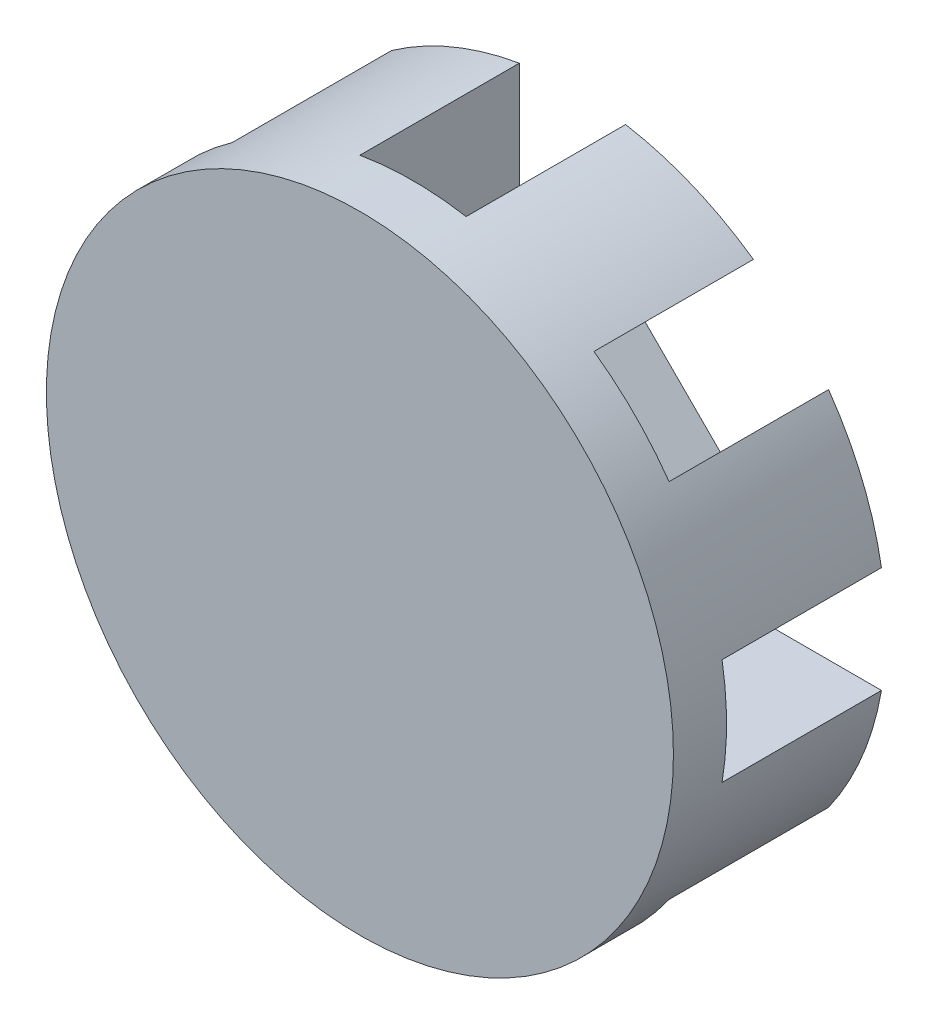
ISO-10303-21;
HEADER;
FILE_DESCRIPTION(('STEP AP214'),'2;1');
FILE_NAME('part.step','',(''),(''),'','','');
FILE_SCHEMA(('AUTOMOTIVE_DESIGN { 1 0 10303 214 1 1 1 1 }'));
ENDSEC;
DATA;
#1=APPLICATION_CONTEXT('core data for automotive mechanical design processes');
#2=APPLICATION_PROTOCOL_DEFINITION('international standard','automotive_design',2000,#1);
#3=PRODUCT_CONTEXT('',#1,'mechanical');
#4=PRODUCT('Part','Part','',(#3));
#5=PRODUCT_RELATED_PRODUCT_CATEGORY('part','',(#4));
#6=PRODUCT_DEFINITION_FORMATION('','',#4);
#7=PRODUCT_DEFINITION_CONTEXT('part definition',#1,'design');
#8=PRODUCT_DEFINITION('design','',#6,#7);
#9=PRODUCT_DEFINITION_SHAPE('','',#8);
#10=(LENGTH_UNIT() NAMED_UNIT(*) SI_UNIT(.MILLI.,.METRE.));
#11=(NAMED_UNIT(*) PLANE_ANGLE_UNIT() SI_UNIT($,.RADIAN.));
#12=(NAMED_UNIT(*) SI_UNIT($,.STERADIAN.) SOLID_ANGLE_UNIT());
#13=UNCERTAINTY_MEASURE_WITH_UNIT(LENGTH_MEASURE(1.E-05),#10,'distance_accuracy_value','');
#14=(GEOMETRIC_REPRESENTATION_CONTEXT(3) GLOBAL_UNCERTAINTY_ASSIGNED_CONTEXT((#13)) GLOBAL_UNIT_ASSIGNED_CONTEXT((#10,
#11,#12)) REPRESENTATION_CONTEXT('',''));
#15=CARTESIAN_POINT('',(0.,0.,0.));
#16=DIRECTION('',(0.,0.,1.));
#17=DIRECTION('',(1.,0.,0.));
#18=AXIS2_PLACEMENT_3D('',#15,#16,#17);
#19=CARTESIAN_POINT('',(0.,0.,4.));
#20=DIRECTION('',(0.,0.,-1.));
#21=DIRECTION('',(-1.,0.,0.));
#22=AXIS2_PLACEMENT_3D('',#19,#20,#21);
#23=CYLINDRICAL_SURFACE('',#22,5.9);
#24=CARTESIAN_POINT('',(0.,0.,4.));
#25=DIRECTION('',(0.,0.,1.));
#26=DIRECTION('',(1.,0.,0.));
#27=AXIS2_PLACEMENT_3D('',#24,#25,#26);
#28=CIRCLE('',#27,5.9);
#29=CARTESIAN_POINT('',(5.9,0.,4.));
#30=VERTEX_POINT('',#29);
#31=EDGE_CURVE('E11',#30,#30,#28,.T.);
#32=ORIENTED_EDGE('',*,*,#31,.F.);
#33=EDGE_LOOP('',(#32));
#34=FACE_BOUND('',#33,.T.);
#35=DIRECTION('',(0.,0.,-1.));
#36=VECTOR('',#35,1.);
#37=CARTESIAN_POINT('',(-5.81463670404265,-1.00000000000002,3.));
#38=LINE('',#37,#36);
#39=CARTESIAN_POINT('',(-5.81463670404265,-1.00000000000002,3.));
#40=VERTEX_POINT('',#39);
#41=CARTESIAN_POINT('',(-5.81463670404265,-1.00000000000002,0.));
#42=VERTEX_POINT('',#41);
#43=EDGE_CURVE('E326',#40,#42,#38,.T.);
#44=ORIENTED_EDGE('',*,*,#43,.T.);
#45=CARTESIAN_POINT('',(0.,0.,0.));
#46=DIRECTION('',(0.,0.,1.));
#47=DIRECTION('',(1.,0.,0.));
#48=AXIS2_PLACEMENT_3D('',#45,#46,#47);
#49=CIRCLE('',#48,5.9);
#50=CARTESIAN_POINT('',(-4.81867582475129,-3.40446226237824,0.));
#51=VERTEX_POINT('',#50);
#52=EDGE_CURVE('E497',#42,#51,#49,.T.);
#53=ORIENTED_EDGE('',*,*,#52,.T.);
#54=DIRECTION('',(0.,0.,-1.));
#55=VECTOR('',#54,1.);
#56=CARTESIAN_POINT('',(-4.81867582475128,-3.40446226237823,3.));
#57=LINE('',#56,#55);
#58=CARTESIAN_POINT('',(-4.81867582475128,-3.40446226237823,3.));
#59=VERTEX_POINT('',#58);
#60=EDGE_CURVE('E345',#59,#51,#57,.T.);
#61=ORIENTED_EDGE('',*,*,#60,.F.);
#62=CARTESIAN_POINT('',(0.,0.,3.));
#63=DIRECTION('',(0.,0.,-1.));
#64=DIRECTION('',(0.707106781186551,-0.707106781186544,0.));
#65=AXIS2_PLACEMENT_3D('',#62,#63,#64);
#66=CIRCLE('',#65,5.9);
#67=CARTESIAN_POINT('',(-3.40446226237818,-4.81867582475132,3.));
#68=VERTEX_POINT('',#67);
#69=EDGE_CURVE('E334',#68,#59,#66,.T.);
#70=ORIENTED_EDGE('',*,*,#69,.F.);
#71=DIRECTION('',(0.,0.,-1.));
#72=VECTOR('',#71,1.);
#73=CARTESIAN_POINT('',(-3.40446226237818,-4.81867582475132,3.));
#74=LINE('',#73,#72);
#75=CARTESIAN_POINT('',(-3.40446226237818,-4.81867582475132,0.));
#76=VERTEX_POINT('',#75);
#77=EDGE_CURVE('E321',#68,#76,#74,.T.);
#78=ORIENTED_EDGE('',*,*,#77,.T.);
#79=CARTESIAN_POINT('',(-1.,-5.81463670404265,0.));
#80=VERTEX_POINT('',#79);
#81=EDGE_CURVE('E503',#76,#80,#49,.T.);
#82=ORIENTED_EDGE('',*,*,#81,.T.);
#83=DIRECTION('',(0.,0.,-1.));
#84=VECTOR('',#83,1.);
#85=CARTESIAN_POINT('',(-1.,-5.81463670404265,3.));
#86=LINE('',#85,#84);
#87=CARTESIAN_POINT('',(-1.,-5.81463670404265,3.));
#88=VERTEX_POINT('',#87);
#89=EDGE_CURVE('E373',#88,#80,#86,.T.);
#90=ORIENTED_EDGE('',*,*,#89,.F.);
#91=CARTESIAN_POINT('',(0.,0.,3.));
#92=DIRECTION('',(0.,0.,-1.));
#93=DIRECTION('',(1.,0.,0.));
#94=AXIS2_PLACEMENT_3D('',#91,#92,#93);
#95=CIRCLE('',#94,5.9);
#96=CARTESIAN_POINT('',(1.,-5.81463670404265,3.));
#97=VERTEX_POINT('',#96);
#98=EDGE_CURVE('E362',#97,#88,#95,.T.);
#99=ORIENTED_EDGE('',*,*,#98,.F.);
#100=DIRECTION('',(0.,0.,-1.));
#101=VECTOR('',#100,1.);
#102=CARTESIAN_POINT('',(1.,-5.81463670404265,3.));
#103=LINE('',#102,#101);
#104=CARTESIAN_POINT('',(1.,-5.81463670404265,0.));
#105=VERTEX_POINT('',#104);
#106=EDGE_CURVE('E350',#97,#105,#103,.T.);
#107=ORIENTED_EDGE('',*,*,#106,.T.);
#108=CARTESIAN_POINT('',(3.40446226237825,-4.81867582475128,0.));
#109=VERTEX_POINT('',#108);
#110=EDGE_CURVE('E501',#105,#109,#49,.T.);
#111=ORIENTED_EDGE('',*,*,#110,.T.);
#112=DIRECTION('',(0.,0.,-1.));
#113=VECTOR('',#112,1.);
#114=CARTESIAN_POINT('',(3.40446226237825,-4.81867582475127,3.));
#115=LINE('',#114,#113);
#116=CARTESIAN_POINT('',(3.40446226237825,-4.81867582475127,3.));
#117=VERTEX_POINT('',#116);
#118=EDGE_CURVE('E401',#117,#109,#115,.T.);
#119=ORIENTED_EDGE('',*,*,#118,.F.);
#120=CARTESIAN_POINT('',(0.,0.,3.));
#121=DIRECTION('',(0.,0.,-1.));
#122=DIRECTION('',(0.707106781186541,0.707106781186554,0.));
#123=AXIS2_PLACEMENT_3D('',#120,#121,#122);
#124=CIRCLE('',#123,5.9);
#125=CARTESIAN_POINT('',(4.81867582475133,-3.40446226237817,3.));
#126=VERTEX_POINT('',#125);
#127=EDGE_CURVE('E390',#126,#117,#124,.T.);
#128=ORIENTED_EDGE('',*,*,#127,.F.);
#129=DIRECTION('',(0.,0.,-1.));
#130=VECTOR('',#129,1.);
#131=CARTESIAN_POINT('',(4.81867582475133,-3.40446226237817,3.));
#132=LINE('',#131,#130);
#133=CARTESIAN_POINT('',(4.81867582475133,-3.40446226237817,0.));
#134=VERTEX_POINT('',#133);
#135=EDGE_CURVE('E378',#126,#134,#132,.T.);
#136=ORIENTED_EDGE('',*,*,#135,.T.);
#137=CARTESIAN_POINT('',(5.81463670404267,-0.999999999999939,0.));
#138=VERTEX_POINT('',#137);
#139=EDGE_CURVE('E271',#134,#138,#49,.T.);
#140=ORIENTED_EDGE('',*,*,#139,.T.);
#141=DIRECTION('',(0.,0.,-1.));
#142=VECTOR('',#141,1.);
#143=CARTESIAN_POINT('',(5.81463670404266,-0.999999999999939,3.));
#144=LINE('',#143,#142);
#145=CARTESIAN_POINT('',(5.81463670404266,-0.999999999999939,3.));
#146=VERTEX_POINT('',#145);
#147=EDGE_CURVE('E63',#146,#138,#144,.T.);
#148=ORIENTED_EDGE('',*,*,#147,.F.);
#149=CARTESIAN_POINT('',(0.,0.,3.));
#150=DIRECTION('',(0.,0.,-1.));
#151=DIRECTION('',(0.,1.,0.));
#152=AXIS2_PLACEMENT_3D('',#149,#150,#151);
#153=CIRCLE('',#152,5.9);
#154=CARTESIAN_POINT('',(5.81463670404264,1.00000000000006,3.));
#155=VERTEX_POINT('',#154);
#156=EDGE_CURVE('E257',#155,#146,#153,.T.);
#157=ORIENTED_EDGE('',*,*,#156,.F.);
#158=DIRECTION('',(0.,0.,-1.));
#159=VECTOR('',#158,1.);
#160=CARTESIAN_POINT('',(5.81463670404264,1.00000000000006,3.));
#161=LINE('',#160,#159);
#162=CARTESIAN_POINT('',(5.81463670404264,1.00000000000006,0.));
#163=VERTEX_POINT('',#162);
#164=EDGE_CURVE('E406',#155,#163,#161,.T.);
#165=ORIENTED_EDGE('',*,*,#164,.T.);
#166=CARTESIAN_POINT('',(4.81867582475126,3.40446226237827,0.));
#167=VERTEX_POINT('',#166);
#168=EDGE_CURVE('E498',#163,#167,#49,.T.);
#169=ORIENTED_EDGE('',*,*,#168,.T.);
#170=DIRECTION('',(0.,0.,-1.));
#171=VECTOR('',#170,1.);
#172=CARTESIAN_POINT('',(4.81867582475126,3.40446226237827,3.));
#173=LINE('',#172,#171);
#174=CARTESIAN_POINT('',(4.81867582475126,3.40446226237827,3.));
#175=VERTEX_POINT('',#174);
#176=EDGE_CURVE('E55',#175,#167,#173,.T.);
#177=ORIENTED_EDGE('',*,*,#176,.F.);
#178=CARTESIAN_POINT('',(0.,0.,3.));
#179=DIRECTION('',(0.,0.,-1.));
#180=DIRECTION('',(-0.707106781186556,0.707106781186539,0.));
#181=AXIS2_PLACEMENT_3D('',#178,#179,#180);
#182=CIRCLE('',#181,5.9);
#183=CARTESIAN_POINT('',(3.40446226237815,4.81867582475135,3.));
#184=VERTEX_POINT('',#183);
#185=EDGE_CURVE('E278',#184,#175,#182,.T.);
#186=ORIENTED_EDGE('',*,*,#185,.F.);
#187=DIRECTION('',(0.,0.,-1.));
#188=VECTOR('',#187,1.);
#189=CARTESIAN_POINT('',(3.40446226237815,4.81867582475135,3.));
#190=LINE('',#189,#188);
#191=CARTESIAN_POINT('',(3.40446226237815,4.81867582475135,0.));
#192=VERTEX_POINT('',#191);
#193=EDGE_CURVE('E296',#184,#192,#190,.T.);
#194=ORIENTED_EDGE('',*,*,#193,.T.);
#195=CARTESIAN_POINT('',(1.,5.81463670404265,0.));
#196=VERTEX_POINT('',#195);
#197=EDGE_CURVE('E467',#192,#196,#49,.T.);
#198=ORIENTED_EDGE('',*,*,#197,.T.);
#199=DIRECTION('',(0.,0.,-1.));
#200=VECTOR('',#199,1.);
#201=CARTESIAN_POINT('',(1.,5.81463670404265,3.));
#202=LINE('',#201,#200);
#203=CARTESIAN_POINT('',(1.,5.81463670404265,3.));
#204=VERTEX_POINT('',#203);
#205=EDGE_CURVE('E456',#204,#196,#202,.T.);
#206=ORIENTED_EDGE('',*,*,#205,.F.);
#207=CARTESIAN_POINT('',(0.,0.,3.));
#208=DIRECTION('',(0.,0.,-1.));
#209=DIRECTION('',(-1.,0.,0.));
#210=AXIS2_PLACEMENT_3D('',#207,#208,#209);
#211=CIRCLE('',#210,5.9);
#212=CARTESIAN_POINT('',(-1.,5.81463670404265,3.));
#213=VERTEX_POINT('',#212);
#214=EDGE_CURVE('E445',#213,#204,#211,.T.);
#215=ORIENTED_EDGE('',*,*,#214,.F.);
#216=DIRECTION('',(0.,0.,-1.));
#217=VECTOR('',#216,1.);
#218=CARTESIAN_POINT('',(-1.,5.81463670404265,3.));
#219=LINE('',#218,#217);
#220=CARTESIAN_POINT('',(-1.,5.81463670404265,0.));
#221=VERTEX_POINT('',#220);
#222=EDGE_CURVE('E464',#213,#221,#219,.T.);
#223=ORIENTED_EDGE('',*,*,#222,.T.);
#224=CARTESIAN_POINT('',(-3.40446226237822,4.8186758247513,0.));
#225=VERTEX_POINT('',#224);
#226=EDGE_CURVE('E44',#221,#225,#49,.T.);
#227=ORIENTED_EDGE('',*,*,#226,.T.);
#228=DIRECTION('',(0.,0.,-1.));
#229=VECTOR('',#228,1.);
#230=CARTESIAN_POINT('',(-3.40446226237822,4.8186758247513,3.));
#231=LINE('',#230,#229);
#232=CARTESIAN_POINT('',(-3.40446226237822,4.8186758247513,3.));
#233=VERTEX_POINT('',#232);
#234=EDGE_CURVE('E428',#233,#225,#231,.T.);
#235=ORIENTED_EDGE('',*,*,#234,.F.);
#236=CARTESIAN_POINT('',(0.,0.,3.));
#237=DIRECTION('',(0.,0.,-1.));
#238=DIRECTION('',(-0.707106781186546,-0.707106781186549,0.));
#239=AXIS2_PLACEMENT_3D('',#236,#237,#238);
#240=CIRCLE('',#239,5.9);
#241=CARTESIAN_POINT('',(-4.81867582475131,3.4044622623782,3.));
#242=VERTEX_POINT('',#241);
#243=EDGE_CURVE('E417',#242,#233,#240,.T.);
#244=ORIENTED_EDGE('',*,*,#243,.F.);
#245=DIRECTION('',(0.,0.,-1.));
#246=VECTOR('',#245,1.);
#247=CARTESIAN_POINT('',(-4.81867582475131,3.4044622623782,3.));
#248=LINE('',#247,#246);
#249=CARTESIAN_POINT('',(-4.81867582475131,3.4044622623782,0.));
#250=VERTEX_POINT('',#249);
#251=EDGE_CURVE('E436',#242,#250,#248,.T.);
#252=ORIENTED_EDGE('',*,*,#251,.T.);
#253=CARTESIAN_POINT('',(-5.81463670404266,0.99999999999998,0.));
#254=VERTEX_POINT('',#253);
#255=EDGE_CURVE('E495',#250,#254,#49,.T.);
#256=ORIENTED_EDGE('',*,*,#255,.T.);
#257=DIRECTION('',(0.,0.,-1.));
#258=VECTOR('',#257,1.);
#259=CARTESIAN_POINT('',(-5.81463670404266,0.99999999999998,3.));
#260=LINE('',#259,#258);
#261=CARTESIAN_POINT('',(-5.81463670404266,0.99999999999998,3.));
#262=VERTEX_POINT('',#261);
#263=EDGE_CURVE('E316',#262,#254,#260,.T.);
#264=ORIENTED_EDGE('',*,*,#263,.F.);
#265=CARTESIAN_POINT('',(0.,0.,3.));
#266=DIRECTION('',(0.,0.,-1.));
#267=DIRECTION('',(0.,-1.,0.));
#268=AXIS2_PLACEMENT_3D('',#265,#266,#267);
#269=CIRCLE('',#268,5.9);
#270=EDGE_CURVE('E305',#40,#262,#269,.T.);
#271=ORIENTED_EDGE('',*,*,#270,.F.);
#272=EDGE_LOOP('',(#44,#53,#61,#70,#78,#82,#90,#99,#107,#111,#119,#128,#136,#140,#148,#157,#165,
#169,#177,#186,#194,#198,#206,#215,#223,#227,#235,#244,#252,#256,#264,#271));
#273=FACE_BOUND('',#272,.T.);
#274=ADVANCED_FACE('F41',(#34,#273),#23,.T.);
#275=CARTESIAN_POINT('',(0.,0.,0.));
#276=DIRECTION('',(0.,0.,1.));
#277=DIRECTION('',(1.,0.,0.));
#278=AXIS2_PLACEMENT_3D('',#275,#276,#277);
#279=PLANE('',#278);
#280=DIRECTION('',(1.,0.,0.));
#281=VECTOR('',#280,1.);
#282=CARTESIAN_POINT('',(-5.81463670404265,-1.00000000000002,0.));
#283=LINE('',#282,#281);
#284=CARTESIAN_POINT('',(-2.93428015022424,-1.00000000000001,0.));
#285=VERTEX_POINT('',#284);
#286=EDGE_CURVE('E309',#42,#285,#283,.T.);
#287=ORIENTED_EDGE('',*,*,#286,.T.);
#288=DIRECTION('',(0.,1.,0.));
#289=VECTOR('',#288,1.);
#290=CARTESIAN_POINT('',(-2.93428015022424,-1.00000000000001,0.));
#291=LINE('',#290,#289);
#292=CARTESIAN_POINT('',(-2.93428015022425,0.99999999999999,0.));
#293=VERTEX_POINT('',#292);
#294=EDGE_CURVE('E320',#285,#293,#291,.T.);
#295=ORIENTED_EDGE('',*,*,#294,.T.);
#296=DIRECTION('',(1.,0.,0.));
#297=VECTOR('',#296,1.);
#298=CARTESIAN_POINT('',(-5.81463670404266,0.99999999999998,0.));
#299=LINE('',#298,#297);
#300=EDGE_CURVE('E317',#254,#293,#299,.T.);
#301=ORIENTED_EDGE('',*,*,#300,.F.);
#302=ORIENTED_EDGE('',*,*,#255,.F.);
#303=DIRECTION('',(0.707106781186549,-0.707106781186546,0.));
#304=VECTOR('',#303,1.);
#305=CARTESIAN_POINT('',(-4.81867582475131,3.4044622623782,0.));
#306=LINE('',#305,#304);
#307=CARTESIAN_POINT('',(-2.78195617331119,1.36774261093809,0.));
#308=VERTEX_POINT('',#307);
#309=EDGE_CURVE('E421',#250,#308,#306,.T.);
#310=ORIENTED_EDGE('',*,*,#309,.T.);
#311=DIRECTION('',(0.707106781186546,0.707106781186549,0.));
#312=VECTOR('',#311,1.);
#313=CARTESIAN_POINT('',(-2.78195617331119,1.36774261093809,0.));
#314=LINE('',#313,#312);
#315=CARTESIAN_POINT('',(-1.3677426109381,2.78195617331119,0.));
#316=VERTEX_POINT('',#315);
#317=EDGE_CURVE('E431',#308,#316,#314,.T.);
#318=ORIENTED_EDGE('',*,*,#317,.T.);
#319=DIRECTION('',(0.707106781186549,-0.707106781186546,0.));
#320=VECTOR('',#319,1.);
#321=CARTESIAN_POINT('',(-3.40446226237822,4.8186758247513,0.));
#322=LINE('',#321,#320);
#323=EDGE_CURVE('E328',#225,#316,#322,.T.);
#324=ORIENTED_EDGE('',*,*,#323,.F.);
#325=ORIENTED_EDGE('',*,*,#226,.F.);
#326=DIRECTION('',(0.,-1.,0.));
#327=VECTOR('',#326,1.);
#328=CARTESIAN_POINT('',(-1.,5.81463670404265,0.));
#329=LINE('',#328,#327);
#330=CARTESIAN_POINT('',(-1.,2.93428015022424,0.));
#331=VERTEX_POINT('',#330);
#332=EDGE_CURVE('E449',#221,#331,#329,.T.);
#333=ORIENTED_EDGE('',*,*,#332,.T.);
#334=DIRECTION('',(1.,0.,0.));
#335=VECTOR('',#334,1.);
#336=CARTESIAN_POINT('',(-1.,2.93428015022424,0.));
#337=LINE('',#336,#335);
#338=CARTESIAN_POINT('',(1.,2.93428015022424,0.));
#339=VERTEX_POINT('',#338);
#340=EDGE_CURVE('E459',#331,#339,#337,.T.);
#341=ORIENTED_EDGE('',*,*,#340,.T.);
#342=DIRECTION('',(0.,-1.,0.));
#343=VECTOR('',#342,1.);
#344=CARTESIAN_POINT('',(1.,5.81463670404265,0.));
#345=LINE('',#344,#343);
#346=EDGE_CURVE('E439',#196,#339,#345,.T.);
#347=ORIENTED_EDGE('',*,*,#346,.F.);
#348=ORIENTED_EDGE('',*,*,#197,.F.);
#349=DIRECTION('',(-0.707106781186539,-0.707106781186556,0.));
#350=VECTOR('',#349,1.);
#351=CARTESIAN_POINT('',(3.40446226237815,4.81867582475135,0.));
#352=LINE('',#351,#350);
#353=CARTESIAN_POINT('',(1.36774261093806,2.78195617331121,0.));
#354=VERTEX_POINT('',#353);
#355=EDGE_CURVE('E282',#192,#354,#352,.T.);
#356=ORIENTED_EDGE('',*,*,#355,.T.);
#357=DIRECTION('',(0.707106781186556,-0.707106781186539,0.));
#358=VECTOR('',#357,1.);
#359=CARTESIAN_POINT('',(1.36774261093806,2.78195617331121,0.));
#360=LINE('',#359,#358);
#361=CARTESIAN_POINT('',(2.78195617331117,1.36774261093813,0.));
#362=VERTEX_POINT('',#361);
#363=EDGE_CURVE('E291',#354,#362,#360,.T.);
#364=ORIENTED_EDGE('',*,*,#363,.T.);
#365=DIRECTION('',(-0.707106781186539,-0.707106781186556,0.));
#366=VECTOR('',#365,1.);
#367=CARTESIAN_POINT('',(4.81867582475126,3.40446226237827,0.));
#368=LINE('',#367,#366);
#369=EDGE_CURVE('E289',#167,#362,#368,.T.);
#370=ORIENTED_EDGE('',*,*,#369,.F.);
#371=ORIENTED_EDGE('',*,*,#168,.F.);
#372=DIRECTION('',(-1.,0.,0.));
#373=VECTOR('',#372,1.);
#374=CARTESIAN_POINT('',(5.81463670404264,1.00000000000006,0.));
#375=LINE('',#374,#373);
#376=CARTESIAN_POINT('',(2.93428015022423,1.00000000000003,0.));
#377=VERTEX_POINT('',#376);
#378=EDGE_CURVE('E265',#163,#377,#375,.T.);
#379=ORIENTED_EDGE('',*,*,#378,.T.);
#380=DIRECTION('',(0.,-1.,0.));
#381=VECTOR('',#380,1.);
#382=CARTESIAN_POINT('',(2.93428015022423,1.00000000000003,0.));
#383=LINE('',#382,#381);
#384=CARTESIAN_POINT('',(2.93428015022425,-0.999999999999969,0.));
#385=VERTEX_POINT('',#384);
#386=EDGE_CURVE('E557',#377,#385,#383,.T.);
#387=ORIENTED_EDGE('',*,*,#386,.T.);
#388=DIRECTION('',(-1.,0.,0.));
#389=VECTOR('',#388,1.);
#390=CARTESIAN_POINT('',(5.81463670404266,-0.999999999999939,0.));
#391=LINE('',#390,#389);
#392=EDGE_CURVE('E299',#138,#385,#391,.T.);
#393=ORIENTED_EDGE('',*,*,#392,.F.);
#394=ORIENTED_EDGE('',*,*,#139,.F.);
#395=DIRECTION('',(-0.707106781186554,0.707106781186541,0.));
#396=VECTOR('',#395,1.);
#397=CARTESIAN_POINT('',(4.81867582475133,-3.40446226237817,0.));
#398=LINE('',#397,#396);
#399=CARTESIAN_POINT('',(2.7819561733112,-1.36774261093807,0.));
#400=VERTEX_POINT('',#399);
#401=EDGE_CURVE('E394',#134,#400,#398,.T.);
#402=ORIENTED_EDGE('',*,*,#401,.T.);
#403=DIRECTION('',(-0.707106781186541,-0.707106781186554,0.));
#404=VECTOR('',#403,1.);
#405=CARTESIAN_POINT('',(2.7819561733112,-1.36774261093807,0.));
#406=LINE('',#405,#404);
#407=CARTESIAN_POINT('',(1.36774261093812,-2.78195617331118,0.));
#408=VERTEX_POINT('',#407);
#409=EDGE_CURVE('E405',#400,#408,#406,.T.);
#410=ORIENTED_EDGE('',*,*,#409,.T.);
#411=DIRECTION('',(-0.707106781186554,0.707106781186541,0.));
#412=VECTOR('',#411,1.);
#413=CARTESIAN_POINT('',(3.40446226237825,-4.81867582475127,0.));
#414=LINE('',#413,#412);
#415=EDGE_CURVE('E402',#109,#408,#414,.T.);
#416=ORIENTED_EDGE('',*,*,#415,.F.);
#417=ORIENTED_EDGE('',*,*,#110,.F.);
#418=DIRECTION('',(0.,1.,0.));
#419=VECTOR('',#418,1.);
#420=CARTESIAN_POINT('',(1.,-5.81463670404265,0.));
#421=LINE('',#420,#419);
#422=CARTESIAN_POINT('',(1.,-2.93428015022424,0.));
#423=VERTEX_POINT('',#422);
#424=EDGE_CURVE('E366',#105,#423,#421,.T.);
#425=ORIENTED_EDGE('',*,*,#424,.T.);
#426=DIRECTION('',(-1.,0.,0.));
#427=VECTOR('',#426,1.);
#428=CARTESIAN_POINT('',(1.,-2.93428015022424,0.));
#429=LINE('',#428,#427);
#430=CARTESIAN_POINT('',(-1.,-2.93428015022424,0.));
#431=VERTEX_POINT('',#430);
#432=EDGE_CURVE('E377',#423,#431,#429,.T.);
#433=ORIENTED_EDGE('',*,*,#432,.T.);
#434=DIRECTION('',(0.,1.,0.));
#435=VECTOR('',#434,1.);
#436=CARTESIAN_POINT('',(-1.,-5.81463670404265,0.));
#437=LINE('',#436,#435);
#438=EDGE_CURVE('E374',#80,#431,#437,.T.);
#439=ORIENTED_EDGE('',*,*,#438,.F.);
#440=ORIENTED_EDGE('',*,*,#81,.F.);
#441=DIRECTION('',(0.707106781186544,0.707106781186551,0.));
#442=VECTOR('',#441,1.);
#443=CARTESIAN_POINT('',(-3.40446226237818,-4.81867582475132,0.));
#444=LINE('',#443,#442);
#445=CARTESIAN_POINT('',(-1.36774261093808,-2.7819561733112,0.));
#446=VERTEX_POINT('',#445);
#447=EDGE_CURVE('E338',#76,#446,#444,.T.);
#448=ORIENTED_EDGE('',*,*,#447,.T.);
#449=DIRECTION('',(-0.707106781186551,0.707106781186544,0.));
#450=VECTOR('',#449,1.);
#451=CARTESIAN_POINT('',(-1.36774261093808,-2.7819561733112,0.));
#452=LINE('',#451,#450);
#453=CARTESIAN_POINT('',(-2.78195617331118,-1.36774261093811,0.));
#454=VERTEX_POINT('',#453);
#455=EDGE_CURVE('E349',#446,#454,#452,.T.);
#456=ORIENTED_EDGE('',*,*,#455,.T.);
#457=DIRECTION('',(0.707106781186544,0.707106781186551,0.));
#458=VECTOR('',#457,1.);
#459=CARTESIAN_POINT('',(-4.81867582475128,-3.40446226237823,0.));
#460=LINE('',#459,#458);
#461=EDGE_CURVE('E346',#51,#454,#460,.T.);
#462=ORIENTED_EDGE('',*,*,#461,.F.);
#463=ORIENTED_EDGE('',*,*,#52,.F.);
#464=EDGE_LOOP('',(#287,#295,#301,#302,#310,#318,#324,#325,#333,#341,#347,#348,#356,#364,#370,
#371,#379,#387,#393,#394,#402,#410,#416,#417,#425,#433,#439,#440,#448,#456,#462,#463));
#465=FACE_BOUND('',#464,.T.);
#466=ADVANCED_FACE('F481',(#465),#279,.F.);
#467=CARTESIAN_POINT('',(0.,0.,4.));
#468=DIRECTION('',(0.,0.,1.));
#469=DIRECTION('',(1.,0.,0.));
#470=AXIS2_PLACEMENT_3D('',#467,#468,#469);
#471=PLANE('',#470);
#472=ORIENTED_EDGE('',*,*,#31,.T.);
#473=EDGE_LOOP('',(#472));
#474=FACE_BOUND('',#473,.T.);
#475=ADVANCED_FACE('F596',(#474),#471,.T.);
#476=CARTESIAN_POINT('',(-1.,5.81463670404265,3.));
#477=DIRECTION('',(1.,0.,0.));
#478=DIRECTION('',(0.,0.,-1.));
#479=AXIS2_PLACEMENT_3D('',#476,#477,#478);
#480=PLANE('',#479);
#481=ORIENTED_EDGE('',*,*,#332,.F.);
#482=ORIENTED_EDGE('',*,*,#222,.F.);
#483=DIRECTION('',(0.,-1.,0.));
#484=VECTOR('',#483,1.);
#485=CARTESIAN_POINT('',(-1.,5.81463670404265,3.));
#486=LINE('',#485,#484);
#487=CARTESIAN_POINT('',(-1.,2.93428015022424,3.));
#488=VERTEX_POINT('',#487);
#489=EDGE_CURVE('E454',#213,#488,#486,.T.);
#490=ORIENTED_EDGE('',*,*,#489,.T.);
#491=DIRECTION('',(0.,0.,-1.));
#492=VECTOR('',#491,1.);
#493=CARTESIAN_POINT('',(-1.,2.93428015022424,3.));
#494=LINE('',#493,#492);
#495=EDGE_CURVE('E468',#488,#331,#494,.T.);
#496=ORIENTED_EDGE('',*,*,#495,.T.);
#497=EDGE_LOOP('',(#481,#482,#490,#496));
#498=FACE_BOUND('',#497,.T.);
#499=ADVANCED_FACE('F600',(#498),#480,.T.);
#500=CARTESIAN_POINT('',(-1.,2.93428015022424,3.));
#501=DIRECTION('',(0.,1.,0.));
#502=DIRECTION('',(0.,0.,1.));
#503=AXIS2_PLACEMENT_3D('',#500,#501,#502);
#504=PLANE('',#503);
#505=ORIENTED_EDGE('',*,*,#340,.F.);
#506=ORIENTED_EDGE('',*,*,#495,.F.);
#507=DIRECTION('',(1.,0.,0.));
#508=VECTOR('',#507,1.);
#509=CARTESIAN_POINT('',(-1.,2.93428015022424,3.));
#510=LINE('',#509,#508);
#511=CARTESIAN_POINT('',(1.,2.93428015022424,3.));
#512=VERTEX_POINT('',#511);
#513=EDGE_CURVE('E452',#488,#512,#510,.T.);
#514=ORIENTED_EDGE('',*,*,#513,.T.);
#515=DIRECTION('',(0.,0.,-1.));
#516=VECTOR('',#515,1.);
#517=CARTESIAN_POINT('',(1.,2.93428015022424,3.));
#518=LINE('',#517,#516);
#519=EDGE_CURVE('E470',#512,#339,#518,.T.);
#520=ORIENTED_EDGE('',*,*,#519,.T.);
#521=EDGE_LOOP('',(#505,#506,#514,#520));
#522=FACE_BOUND('',#521,.T.);
#523=ADVANCED_FACE('F486',(#522),#504,.T.);
#524=CARTESIAN_POINT('',(1.,5.81463670404265,3.));
#525=DIRECTION('',(1.,0.,0.));
#526=DIRECTION('',(0.,0.,-1.));
#527=AXIS2_PLACEMENT_3D('',#524,#525,#526);
#528=PLANE('',#527);
#529=ORIENTED_EDGE('',*,*,#346,.T.);
#530=ORIENTED_EDGE('',*,*,#519,.F.);
#531=DIRECTION('',(0.,-1.,0.));
#532=VECTOR('',#531,1.);
#533=CARTESIAN_POINT('',(1.,5.81463670404265,3.));
#534=LINE('',#533,#532);
#535=EDGE_CURVE('E448',#204,#512,#534,.T.);
#536=ORIENTED_EDGE('',*,*,#535,.F.);
#537=ORIENTED_EDGE('',*,*,#205,.T.);
#538=EDGE_LOOP('',(#529,#530,#536,#537));
#539=FACE_BOUND('',#538,.T.);
#540=ADVANCED_FACE('F476',(#539),#528,.F.);
#541=CARTESIAN_POINT('',(0.,0.,3.));
#542=DIRECTION('',(0.,0.,-1.));
#543=DIRECTION('',(-1.,0.,0.));
#544=AXIS2_PLACEMENT_3D('',#541,#542,#543);
#545=PLANE('',#544);
#546=ORIENTED_EDGE('',*,*,#214,.T.);
#547=ORIENTED_EDGE('',*,*,#535,.T.);
#548=ORIENTED_EDGE('',*,*,#513,.F.);
#549=ORIENTED_EDGE('',*,*,#489,.F.);
#550=EDGE_LOOP('',(#546,#547,#548,#549));
#551=FACE_BOUND('',#550,.T.);
#552=ADVANCED_FACE('F489',(#551),#545,.T.);
#553=CARTESIAN_POINT('',(-4.81867582475131,3.4044622623782,3.));
#554=DIRECTION('',(0.707106781186546,0.707106781186549,0.));
#555=DIRECTION('',(-0.707106781186549,0.707106781186546,0.));
#556=AXIS2_PLACEMENT_3D('',#553,#554,#555);
#557=PLANE('',#556);
#558=ORIENTED_EDGE('',*,*,#309,.F.);
#559=ORIENTED_EDGE('',*,*,#251,.F.);
#560=DIRECTION('',(0.707106781186549,-0.707106781186546,0.));
#561=VECTOR('',#560,1.);
#562=CARTESIAN_POINT('',(-4.81867582475131,3.4044622623782,3.));
#563=LINE('',#562,#561);
#564=CARTESIAN_POINT('',(-2.78195617331119,1.36774261093809,3.));
#565=VERTEX_POINT('',#564);
#566=EDGE_CURVE('E426',#242,#565,#563,.T.);
#567=ORIENTED_EDGE('',*,*,#566,.T.);
#568=DIRECTION('',(0.,0.,-1.));
#569=VECTOR('',#568,1.);
#570=CARTESIAN_POINT('',(-2.78195617331119,1.36774261093809,3.));
#571=LINE('',#570,#569);
#572=EDGE_CURVE('E440',#565,#308,#571,.T.);
#573=ORIENTED_EDGE('',*,*,#572,.T.);
#574=EDGE_LOOP('',(#558,#559,#567,#573));
#575=FACE_BOUND('',#574,.T.);
#576=ADVANCED_FACE('F612',(#575),#557,.T.);
#577=CARTESIAN_POINT('',(-2.78195617331119,1.36774261093809,3.));
#578=DIRECTION('',(-0.707106781186549,0.707106781186546,0.));
#579=DIRECTION('',(-0.707106781186546,-0.707106781186549,0.));
#580=AXIS2_PLACEMENT_3D('',#577,#578,#579);
#581=PLANE('',#580);
#582=ORIENTED_EDGE('',*,*,#317,.F.);
#583=ORIENTED_EDGE('',*,*,#572,.F.);
#584=DIRECTION('',(0.707106781186546,0.707106781186549,0.));
#585=VECTOR('',#584,1.);
#586=CARTESIAN_POINT('',(-2.78195617331119,1.36774261093809,3.));
#587=LINE('',#586,#585);
#588=CARTESIAN_POINT('',(-1.3677426109381,2.78195617331119,3.));
#589=VERTEX_POINT('',#588);
#590=EDGE_CURVE('E424',#565,#589,#587,.T.);
#591=ORIENTED_EDGE('',*,*,#590,.T.);
#592=DIRECTION('',(0.,0.,-1.));
#593=VECTOR('',#592,1.);
#594=CARTESIAN_POINT('',(-1.3677426109381,2.78195617331119,3.));
#595=LINE('',#594,#593);
#596=EDGE_CURVE('E442',#589,#316,#595,.T.);
#597=ORIENTED_EDGE('',*,*,#596,.T.);
#598=EDGE_LOOP('',(#582,#583,#591,#597));
#599=FACE_BOUND('',#598,.T.);
#600=ADVANCED_FACE('F616',(#599),#581,.T.);
#601=CARTESIAN_POINT('',(-3.40446226237822,4.8186758247513,3.));
#602=DIRECTION('',(0.707106781186546,0.707106781186549,0.));
#603=DIRECTION('',(-0.707106781186549,0.707106781186546,0.));
#604=AXIS2_PLACEMENT_3D('',#601,#602,#603);
#605=PLANE('',#604);
#606=ORIENTED_EDGE('',*,*,#323,.T.);
#607=ORIENTED_EDGE('',*,*,#596,.F.);
#608=DIRECTION('',(0.707106781186549,-0.707106781186546,0.));
#609=VECTOR('',#608,1.);
#610=CARTESIAN_POINT('',(-3.40446226237822,4.8186758247513,3.));
#611=LINE('',#610,#609);
#612=EDGE_CURVE('E420',#233,#589,#611,.T.);
#613=ORIENTED_EDGE('',*,*,#612,.F.);
#614=ORIENTED_EDGE('',*,*,#234,.T.);
#615=EDGE_LOOP('',(#606,#607,#613,#614));
#616=FACE_BOUND('',#615,.T.);
#617=ADVANCED_FACE('F613',(#616),#605,.F.);
#618=CARTESIAN_POINT('',(0.,0.,3.));
#619=DIRECTION('',(0.,0.,-1.));
#620=DIRECTION('',(-0.707106781186546,-0.707106781186549,0.));
#621=AXIS2_PLACEMENT_3D('',#618,#619,#620);
#622=PLANE('',#621);
#623=ORIENTED_EDGE('',*,*,#243,.T.);
#624=ORIENTED_EDGE('',*,*,#612,.T.);
#625=ORIENTED_EDGE('',*,*,#590,.F.);
#626=ORIENTED_EDGE('',*,*,#566,.F.);
#627=EDGE_LOOP('',(#623,#624,#625,#626));
#628=FACE_BOUND('',#627,.T.);
#629=ADVANCED_FACE('F588',(#628),#622,.T.);
#630=CARTESIAN_POINT('',(3.40446226237815,4.81867582475135,3.));
#631=DIRECTION('',(0.707106781186556,-0.707106781186539,0.));
#632=DIRECTION('',(0.707106781186539,0.707106781186556,0.));
#633=AXIS2_PLACEMENT_3D('',#630,#631,#632);
#634=PLANE('',#633);
#635=ORIENTED_EDGE('',*,*,#355,.F.);
#636=ORIENTED_EDGE('',*,*,#193,.F.);
#637=DIRECTION('',(-0.707106781186539,-0.707106781186556,0.));
#638=VECTOR('',#637,1.);
#639=CARTESIAN_POINT('',(3.40446226237815,4.81867582475135,3.));
#640=LINE('',#639,#638);
#641=CARTESIAN_POINT('',(1.36774261093806,2.78195617331121,3.));
#642=VERTEX_POINT('',#641);
#643=EDGE_CURVE('E287',#184,#642,#640,.T.);
#644=ORIENTED_EDGE('',*,*,#643,.T.);
#645=DIRECTION('',(0.,0.,-1.));
#646=VECTOR('',#645,1.);
#647=CARTESIAN_POINT('',(1.36774261093806,2.78195617331121,3.));
#648=LINE('',#647,#646);
#649=EDGE_CURVE('E300',#642,#354,#648,.T.);
#650=ORIENTED_EDGE('',*,*,#649,.T.);
#651=EDGE_LOOP('',(#635,#636,#644,#650));
#652=FACE_BOUND('',#651,.T.);
#653=ADVANCED_FACE('F578',(#652),#634,.T.);
#654=CARTESIAN_POINT('',(1.36774261093806,2.78195617331121,3.));
#655=DIRECTION('',(0.707106781186539,0.707106781186556,0.));
#656=DIRECTION('',(-0.707106781186556,0.707106781186539,0.));
#657=AXIS2_PLACEMENT_3D('',#654,#655,#656);
#658=PLANE('',#657);
#659=ORIENTED_EDGE('',*,*,#363,.F.);
#660=ORIENTED_EDGE('',*,*,#649,.F.);
#661=DIRECTION('',(0.707106781186556,-0.707106781186539,0.));
#662=VECTOR('',#661,1.);
#663=CARTESIAN_POINT('',(1.36774261093806,2.78195617331121,3.));
#664=LINE('',#663,#662);
#665=CARTESIAN_POINT('',(2.78195617331117,1.36774261093813,3.));
#666=VERTEX_POINT('',#665);
#667=EDGE_CURVE('E285',#642,#666,#664,.T.);
#668=ORIENTED_EDGE('',*,*,#667,.T.);
#669=DIRECTION('',(0.,0.,-1.));
#670=VECTOR('',#669,1.);
#671=CARTESIAN_POINT('',(2.78195617331117,1.36774261093813,3.));
#672=LINE('',#671,#670);
#673=EDGE_CURVE('E302',#666,#362,#672,.T.);
#674=ORIENTED_EDGE('',*,*,#673,.T.);
#675=EDGE_LOOP('',(#659,#660,#668,#674));
#676=FACE_BOUND('',#675,.T.);
#677=ADVANCED_FACE('F580',(#676),#658,.T.);
#678=CARTESIAN_POINT('',(4.81867582475126,3.40446226237827,3.));
#679=DIRECTION('',(0.707106781186556,-0.707106781186539,0.));
#680=DIRECTION('',(0.707106781186539,0.707106781186556,0.));
#681=AXIS2_PLACEMENT_3D('',#678,#679,#680);
#682=PLANE('',#681);
#683=ORIENTED_EDGE('',*,*,#369,.T.);
#684=ORIENTED_EDGE('',*,*,#673,.F.);
#685=DIRECTION('',(-0.707106781186539,-0.707106781186556,0.));
#686=VECTOR('',#685,1.);
#687=CARTESIAN_POINT('',(4.81867582475126,3.40446226237827,3.));
#688=LINE('',#687,#686);
#689=EDGE_CURVE('E281',#175,#666,#688,.T.);
#690=ORIENTED_EDGE('',*,*,#689,.F.);
#691=ORIENTED_EDGE('',*,*,#176,.T.);
#692=EDGE_LOOP('',(#683,#684,#690,#691));
#693=FACE_BOUND('',#692,.T.);
#694=ADVANCED_FACE('F570',(#693),#682,.F.);
#695=CARTESIAN_POINT('',(0.,0.,3.));
#696=DIRECTION('',(0.,0.,-1.));
#697=DIRECTION('',(-0.707106781186556,0.707106781186539,0.));
#698=AXIS2_PLACEMENT_3D('',#695,#696,#697);
#699=PLANE('',#698);
#700=ORIENTED_EDGE('',*,*,#185,.T.);
#701=ORIENTED_EDGE('',*,*,#689,.T.);
#702=ORIENTED_EDGE('',*,*,#667,.F.);
#703=ORIENTED_EDGE('',*,*,#643,.F.);
#704=EDGE_LOOP('',(#700,#701,#702,#703));
#705=FACE_BOUND('',#704,.T.);
#706=ADVANCED_FACE('F574',(#705),#699,.T.);
#707=CARTESIAN_POINT('',(5.81463670404264,1.00000000000006,3.));
#708=DIRECTION('',(0.,-1.,0.));
#709=DIRECTION('',(1.,0.,0.));
#710=AXIS2_PLACEMENT_3D('',#707,#708,#709);
#711=PLANE('',#710);
#712=ORIENTED_EDGE('',*,*,#378,.F.);
#713=ORIENTED_EDGE('',*,*,#164,.F.);
#714=DIRECTION('',(-1.,0.,0.));
#715=VECTOR('',#714,1.);
#716=CARTESIAN_POINT('',(5.81463670404264,1.00000000000006,3.));
#717=LINE('',#716,#715);
#718=CARTESIAN_POINT('',(2.93428015022423,1.00000000000003,3.));
#719=VERTEX_POINT('',#718);
#720=EDGE_CURVE('E262',#155,#719,#717,.T.);
#721=ORIENTED_EDGE('',*,*,#720,.T.);
#722=DIRECTION('',(0.,0.,-1.));
#723=VECTOR('',#722,1.);
#724=CARTESIAN_POINT('',(2.93428015022423,1.00000000000003,3.));
#725=LINE('',#724,#723);
#726=EDGE_CURVE('E273',#719,#377,#725,.T.);
#727=ORIENTED_EDGE('',*,*,#726,.T.);
#728=EDGE_LOOP('',(#712,#713,#721,#727));
#729=FACE_BOUND('',#728,.T.);
#730=ADVANCED_FACE('F565',(#729),#711,.T.);
#731=CARTESIAN_POINT('',(2.93428015022423,1.00000000000003,3.));
#732=DIRECTION('',(1.,0.,0.));
#733=DIRECTION('',(0.,1.,0.));
#734=AXIS2_PLACEMENT_3D('',#731,#732,#733);
#735=PLANE('',#734);
#736=ORIENTED_EDGE('',*,*,#386,.F.);
#737=ORIENTED_EDGE('',*,*,#726,.F.);
#738=DIRECTION('',(0.,-1.,0.));
#739=VECTOR('',#738,1.);
#740=CARTESIAN_POINT('',(2.93428015022423,1.00000000000003,3.));
#741=LINE('',#740,#739);
#742=CARTESIAN_POINT('',(2.93428015022425,-0.999999999999969,3.));
#743=VERTEX_POINT('',#742);
#744=EDGE_CURVE('E256',#719,#743,#741,.T.);
#745=ORIENTED_EDGE('',*,*,#744,.T.);
#746=DIRECTION('',(0.,0.,-1.));
#747=VECTOR('',#746,1.);
#748=CARTESIAN_POINT('',(2.93428015022425,-0.999999999999969,3.));
#749=LINE('',#748,#747);
#750=EDGE_CURVE('E253',#743,#385,#749,.T.);
#751=ORIENTED_EDGE('',*,*,#750,.T.);
#752=EDGE_LOOP('',(#736,#737,#745,#751));
#753=FACE_BOUND('',#752,.T.);
#754=ADVANCED_FACE('F567',(#753),#735,.T.);
#755=CARTESIAN_POINT('',(5.81463670404266,-0.999999999999939,3.));
#756=DIRECTION('',(0.,-1.,0.));
#757=DIRECTION('',(1.,0.,0.));
#758=AXIS2_PLACEMENT_3D('',#755,#756,#757);
#759=PLANE('',#758);
#760=ORIENTED_EDGE('',*,*,#392,.T.);
#761=ORIENTED_EDGE('',*,*,#750,.F.);
#762=DIRECTION('',(-1.,0.,0.));
#763=VECTOR('',#762,1.);
#764=CARTESIAN_POINT('',(5.81463670404266,-0.999999999999939,3.));
#765=LINE('',#764,#763);
#766=EDGE_CURVE('E250',#146,#743,#765,.T.);
#767=ORIENTED_EDGE('',*,*,#766,.F.);
#768=ORIENTED_EDGE('',*,*,#147,.T.);
#769=EDGE_LOOP('',(#760,#761,#767,#768));
#770=FACE_BOUND('',#769,.T.);
#771=ADVANCED_FACE('F252',(#770),#759,.F.);
#772=CARTESIAN_POINT('',(0.,0.,3.));
#773=DIRECTION('',(0.,0.,-1.));
#774=DIRECTION('',(0.,1.,0.));
#775=AXIS2_PLACEMENT_3D('',#772,#773,#774);
#776=PLANE('',#775);
#777=ORIENTED_EDGE('',*,*,#156,.T.);
#778=ORIENTED_EDGE('',*,*,#766,.T.);
#779=ORIENTED_EDGE('',*,*,#744,.F.);
#780=ORIENTED_EDGE('',*,*,#720,.F.);
#781=EDGE_LOOP('',(#777,#778,#779,#780));
#782=FACE_BOUND('',#781,.T.);
#783=ADVANCED_FACE('F261',(#782),#776,.T.);
#784=CARTESIAN_POINT('',(4.81867582475133,-3.40446226237817,3.));
#785=DIRECTION('',(-0.707106781186541,-0.707106781186554,0.));
#786=DIRECTION('',(0.707106781186554,-0.707106781186541,0.));
#787=AXIS2_PLACEMENT_3D('',#784,#785,#786);
#788=PLANE('',#787);
#789=ORIENTED_EDGE('',*,*,#401,.F.);
#790=ORIENTED_EDGE('',*,*,#135,.F.);
#791=DIRECTION('',(-0.707106781186554,0.707106781186541,0.));
#792=VECTOR('',#791,1.);
#793=CARTESIAN_POINT('',(4.81867582475133,-3.40446226237817,3.));
#794=LINE('',#793,#792);
#795=CARTESIAN_POINT('',(2.7819561733112,-1.36774261093807,3.));
#796=VERTEX_POINT('',#795);
#797=EDGE_CURVE('E399',#126,#796,#794,.T.);
#798=ORIENTED_EDGE('',*,*,#797,.T.);
#799=DIRECTION('',(0.,0.,-1.));
#800=VECTOR('',#799,1.);
#801=CARTESIAN_POINT('',(2.7819561733112,-1.36774261093807,3.));
#802=LINE('',#801,#800);
#803=EDGE_CURVE('E412',#796,#400,#802,.T.);
#804=ORIENTED_EDGE('',*,*,#803,.T.);
#805=EDGE_LOOP('',(#789,#790,#798,#804));
#806=FACE_BOUND('',#805,.T.);
#807=ADVANCED_FACE('F551',(#806),#788,.T.);
#808=CARTESIAN_POINT('',(2.7819561733112,-1.36774261093807,3.));
#809=DIRECTION('',(0.707106781186554,-0.707106781186541,0.));
#810=DIRECTION('',(0.707106781186541,0.707106781186554,0.));
#811=AXIS2_PLACEMENT_3D('',#808,#809,#810);
#812=PLANE('',#811);
#813=ORIENTED_EDGE('',*,*,#409,.F.);
#814=ORIENTED_EDGE('',*,*,#803,.F.);
#815=DIRECTION('',(-0.707106781186541,-0.707106781186554,0.));
#816=VECTOR('',#815,1.);
#817=CARTESIAN_POINT('',(2.7819561733112,-1.36774261093807,3.));
#818=LINE('',#817,#816);
#819=CARTESIAN_POINT('',(1.36774261093812,-2.78195617331118,3.));
#820=VERTEX_POINT('',#819);
#821=EDGE_CURVE('E397',#796,#820,#818,.T.);
#822=ORIENTED_EDGE('',*,*,#821,.T.);
#823=DIRECTION('',(0.,0.,-1.));
#824=VECTOR('',#823,1.);
#825=CARTESIAN_POINT('',(1.36774261093812,-2.78195617331118,3.));
#826=LINE('',#825,#824);
#827=EDGE_CURVE('E414',#820,#408,#826,.T.);
#828=ORIENTED_EDGE('',*,*,#827,.T.);
#829=EDGE_LOOP('',(#813,#814,#822,#828));
#830=FACE_BOUND('',#829,.T.);
#831=ADVANCED_FACE('F553',(#830),#812,.T.);
#832=CARTESIAN_POINT('',(3.40446226237825,-4.81867582475127,3.));
#833=DIRECTION('',(-0.707106781186541,-0.707106781186554,0.));
#834=DIRECTION('',(0.707106781186554,-0.707106781186541,0.));
#835=AXIS2_PLACEMENT_3D('',#832,#833,#834);
#836=PLANE('',#835);
#837=ORIENTED_EDGE('',*,*,#415,.T.);
#838=ORIENTED_EDGE('',*,*,#827,.F.);
#839=DIRECTION('',(-0.707106781186554,0.707106781186541,0.));
#840=VECTOR('',#839,1.);
#841=CARTESIAN_POINT('',(3.40446226237825,-4.81867582475127,3.));
#842=LINE('',#841,#840);
#843=EDGE_CURVE('E393',#117,#820,#842,.T.);
#844=ORIENTED_EDGE('',*,*,#843,.F.);
#845=ORIENTED_EDGE('',*,*,#118,.T.);
#846=EDGE_LOOP('',(#837,#838,#844,#845));
#847=FACE_BOUND('',#846,.T.);
#848=ADVANCED_FACE('F543',(#847),#836,.F.);
#849=CARTESIAN_POINT('',(0.,0.,3.));
#850=DIRECTION('',(0.,0.,-1.));
#851=DIRECTION('',(0.707106781186541,0.707106781186554,0.));
#852=AXIS2_PLACEMENT_3D('',#849,#850,#851);
#853=PLANE('',#852);
#854=ORIENTED_EDGE('',*,*,#127,.T.);
#855=ORIENTED_EDGE('',*,*,#843,.T.);
#856=ORIENTED_EDGE('',*,*,#821,.F.);
#857=ORIENTED_EDGE('',*,*,#797,.F.);
#858=EDGE_LOOP('',(#854,#855,#856,#857));
#859=FACE_BOUND('',#858,.T.);
#860=ADVANCED_FACE('F547',(#859),#853,.T.);
#861=CARTESIAN_POINT('',(1.,-5.81463670404265,3.));
#862=DIRECTION('',(-1.,0.,0.));
#863=DIRECTION('',(0.,0.,1.));
#864=AXIS2_PLACEMENT_3D('',#861,#862,#863);
#865=PLANE('',#864);
#866=ORIENTED_EDGE('',*,*,#424,.F.);
#867=ORIENTED_EDGE('',*,*,#106,.F.);
#868=DIRECTION('',(0.,1.,0.));
#869=VECTOR('',#868,1.);
#870=CARTESIAN_POINT('',(1.,-5.81463670404265,3.));
#871=LINE('',#870,#869);
#872=CARTESIAN_POINT('',(1.,-2.93428015022424,3.));
#873=VERTEX_POINT('',#872);
#874=EDGE_CURVE('E371',#97,#873,#871,.T.);
#875=ORIENTED_EDGE('',*,*,#874,.T.);
#876=DIRECTION('',(0.,0.,-1.));
#877=VECTOR('',#876,1.);
#878=CARTESIAN_POINT('',(1.,-2.93428015022424,3.));
#879=LINE('',#878,#877);
#880=EDGE_CURVE('E385',#873,#423,#879,.T.);
#881=ORIENTED_EDGE('',*,*,#880,.T.);
#882=EDGE_LOOP('',(#866,#867,#875,#881));
#883=FACE_BOUND('',#882,.T.);
#884=ADVANCED_FACE('F536',(#883),#865,.T.);
#885=CARTESIAN_POINT('',(1.,-2.93428015022424,3.));
#886=DIRECTION('',(0.,-1.,0.));
#887=DIRECTION('',(0.,0.,-1.));
#888=AXIS2_PLACEMENT_3D('',#885,#886,#887);
#889=PLANE('',#888);
#890=ORIENTED_EDGE('',*,*,#432,.F.);
#891=ORIENTED_EDGE('',*,*,#880,.F.);
#892=DIRECTION('',(-1.,0.,0.));
#893=VECTOR('',#892,1.);
#894=CARTESIAN_POINT('',(1.,-2.93428015022424,3.));
#895=LINE('',#894,#893);
#896=CARTESIAN_POINT('',(-1.,-2.93428015022424,3.));
#897=VERTEX_POINT('',#896);
#898=EDGE_CURVE('E369',#873,#897,#895,.T.);
#899=ORIENTED_EDGE('',*,*,#898,.T.);
#900=DIRECTION('',(0.,0.,-1.));
#901=VECTOR('',#900,1.);
#902=CARTESIAN_POINT('',(-1.,-2.93428015022424,3.));
#903=LINE('',#902,#901);
#904=EDGE_CURVE('E387',#897,#431,#903,.T.);
#905=ORIENTED_EDGE('',*,*,#904,.T.);
#906=EDGE_LOOP('',(#890,#891,#899,#905));
#907=FACE_BOUND('',#906,.T.);
#908=ADVANCED_FACE('F538',(#907),#889,.T.);
#909=CARTESIAN_POINT('',(-1.,-5.81463670404265,3.));
#910=DIRECTION('',(-1.,0.,0.));
#911=DIRECTION('',(0.,0.,1.));
#912=AXIS2_PLACEMENT_3D('',#909,#910,#911);
#913=PLANE('',#912);
#914=ORIENTED_EDGE('',*,*,#438,.T.);
#915=ORIENTED_EDGE('',*,*,#904,.F.);
#916=DIRECTION('',(0.,1.,0.));
#917=VECTOR('',#916,1.);
#918=CARTESIAN_POINT('',(-1.,-5.81463670404265,3.));
#919=LINE('',#918,#917);
#920=EDGE_CURVE('E365',#88,#897,#919,.T.);
#921=ORIENTED_EDGE('',*,*,#920,.F.);
#922=ORIENTED_EDGE('',*,*,#89,.T.);
#923=EDGE_LOOP('',(#914,#915,#921,#922));
#924=FACE_BOUND('',#923,.T.);
#925=ADVANCED_FACE('F528',(#924),#913,.F.);
#926=CARTESIAN_POINT('',(0.,0.,3.));
#927=DIRECTION('',(0.,0.,-1.));
#928=DIRECTION('',(1.,0.,0.));
#929=AXIS2_PLACEMENT_3D('',#926,#927,#928);
#930=PLANE('',#929);
#931=ORIENTED_EDGE('',*,*,#98,.T.);
#932=ORIENTED_EDGE('',*,*,#920,.T.);
#933=ORIENTED_EDGE('',*,*,#898,.F.);
#934=ORIENTED_EDGE('',*,*,#874,.F.);
#935=EDGE_LOOP('',(#931,#932,#933,#934));
#936=FACE_BOUND('',#935,.T.);
#937=ADVANCED_FACE('F532',(#936),#930,.T.);
#938=CARTESIAN_POINT('',(-3.40446226237818,-4.81867582475132,3.));
#939=DIRECTION('',(-0.707106781186551,0.707106781186544,0.));
#940=DIRECTION('',(-0.707106781186544,-0.707106781186551,0.));
#941=AXIS2_PLACEMENT_3D('',#938,#939,#940);
#942=PLANE('',#941);
#943=ORIENTED_EDGE('',*,*,#447,.F.);
#944=ORIENTED_EDGE('',*,*,#77,.F.);
#945=DIRECTION('',(0.707106781186544,0.707106781186551,0.));
#946=VECTOR('',#945,1.);
#947=CARTESIAN_POINT('',(-3.40446226237818,-4.81867582475132,3.));
#948=LINE('',#947,#946);
#949=CARTESIAN_POINT('',(-1.36774261093808,-2.7819561733112,3.));
#950=VERTEX_POINT('',#949);
#951=EDGE_CURVE('E343',#68,#950,#948,.T.);
#952=ORIENTED_EDGE('',*,*,#951,.T.);
#953=DIRECTION('',(0.,0.,-1.));
#954=VECTOR('',#953,1.);
#955=CARTESIAN_POINT('',(-1.36774261093808,-2.7819561733112,3.));
#956=LINE('',#955,#954);
#957=EDGE_CURVE('E357',#950,#446,#956,.T.);
#958=ORIENTED_EDGE('',*,*,#957,.T.);
#959=EDGE_LOOP('',(#943,#944,#952,#958));
#960=FACE_BOUND('',#959,.T.);
#961=ADVANCED_FACE('F643',(#960),#942,.T.);
#962=CARTESIAN_POINT('',(-1.36774261093808,-2.7819561733112,3.));
#963=DIRECTION('',(-0.707106781186544,-0.707106781186551,0.));
#964=DIRECTION('',(0.707106781186551,-0.707106781186544,0.));
#965=AXIS2_PLACEMENT_3D('',#962,#963,#964);
#966=PLANE('',#965);
#967=ORIENTED_EDGE('',*,*,#455,.F.);
#968=ORIENTED_EDGE('',*,*,#957,.F.);
#969=DIRECTION('',(-0.707106781186551,0.707106781186544,0.));
#970=VECTOR('',#969,1.);
#971=CARTESIAN_POINT('',(-1.36774261093808,-2.7819561733112,3.));
#972=LINE('',#971,#970);
#973=CARTESIAN_POINT('',(-2.78195617331118,-1.36774261093811,3.));
#974=VERTEX_POINT('',#973);
#975=EDGE_CURVE('E341',#950,#974,#972,.T.);
#976=ORIENTED_EDGE('',*,*,#975,.T.);
#977=DIRECTION('',(0.,0.,-1.));
#978=VECTOR('',#977,1.);
#979=CARTESIAN_POINT('',(-2.78195617331118,-1.36774261093811,3.));
#980=LINE('',#979,#978);
#981=EDGE_CURVE('E359',#974,#454,#980,.T.);
#982=ORIENTED_EDGE('',*,*,#981,.T.);
#983=EDGE_LOOP('',(#967,#968,#976,#982));
#984=FACE_BOUND('',#983,.T.);
#985=ADVANCED_FACE('F646',(#984),#966,.T.);
#986=CARTESIAN_POINT('',(-4.81867582475128,-3.40446226237823,3.));
#987=DIRECTION('',(-0.707106781186551,0.707106781186544,0.));
#988=DIRECTION('',(-0.707106781186544,-0.707106781186551,0.));
#989=AXIS2_PLACEMENT_3D('',#986,#987,#988);
#990=PLANE('',#989);
#991=ORIENTED_EDGE('',*,*,#461,.T.);
#992=ORIENTED_EDGE('',*,*,#981,.F.);
#993=DIRECTION('',(0.707106781186544,0.707106781186551,0.));
#994=VECTOR('',#993,1.);
#995=CARTESIAN_POINT('',(-4.81867582475128,-3.40446226237823,3.));
#996=LINE('',#995,#994);
#997=EDGE_CURVE('E337',#59,#974,#996,.T.);
#998=ORIENTED_EDGE('',*,*,#997,.F.);
#999=ORIENTED_EDGE('',*,*,#60,.T.);
#1000=EDGE_LOOP('',(#991,#992,#998,#999));
#1001=FACE_BOUND('',#1000,.T.);
#1002=ADVANCED_FACE('F518',(#1001),#990,.F.);
#1003=CARTESIAN_POINT('',(0.,0.,3.));
#1004=DIRECTION('',(0.,0.,-1.));
#1005=DIRECTION('',(0.707106781186551,-0.707106781186544,0.));
#1006=AXIS2_PLACEMENT_3D('',#1003,#1004,#1005);
#1007=PLANE('',#1006);
#1008=ORIENTED_EDGE('',*,*,#69,.T.);
#1009=ORIENTED_EDGE('',*,*,#997,.T.);
#1010=ORIENTED_EDGE('',*,*,#975,.F.);
#1011=ORIENTED_EDGE('',*,*,#951,.F.);
#1012=EDGE_LOOP('',(#1008,#1009,#1010,#1011));
#1013=FACE_BOUND('',#1012,.T.);
#1014=ADVANCED_FACE('F522',(#1013),#1007,.T.);
#1015=CARTESIAN_POINT('',(-5.81463670404265,-1.00000000000002,3.));
#1016=DIRECTION('',(0.,1.,0.));
#1017=DIRECTION('',(-1.,0.,0.));
#1018=AXIS2_PLACEMENT_3D('',#1015,#1016,#1017);
#1019=PLANE('',#1018);
#1020=ORIENTED_EDGE('',*,*,#286,.F.);
#1021=ORIENTED_EDGE('',*,*,#43,.F.);
#1022=DIRECTION('',(1.,0.,0.));
#1023=VECTOR('',#1022,1.);
#1024=CARTESIAN_POINT('',(-5.81463670404265,-1.00000000000002,3.));
#1025=LINE('',#1024,#1023);
#1026=CARTESIAN_POINT('',(-2.93428015022424,-1.00000000000001,3.));
#1027=VERTEX_POINT('',#1026);
#1028=EDGE_CURVE('E314',#40,#1027,#1025,.T.);
#1029=ORIENTED_EDGE('',*,*,#1028,.T.);
#1030=DIRECTION('',(0.,0.,-1.));
#1031=VECTOR('',#1030,1.);
#1032=CARTESIAN_POINT('',(-2.93428015022424,-1.00000000000001,3.));
#1033=LINE('',#1032,#1031);
#1034=EDGE_CURVE('E329',#1027,#285,#1033,.T.);
#1035=ORIENTED_EDGE('',*,*,#1034,.T.);
#1036=EDGE_LOOP('',(#1020,#1021,#1029,#1035));
#1037=FACE_BOUND('',#1036,.T.);
#1038=ADVANCED_FACE('F654',(#1037),#1019,.T.);
#1039=CARTESIAN_POINT('',(-2.93428015022424,-1.00000000000001,3.));
#1040=DIRECTION('',(-1.,0.,0.));
#1041=DIRECTION('',(0.,-1.,0.));
#1042=AXIS2_PLACEMENT_3D('',#1039,#1040,#1041);
#1043=PLANE('',#1042);
#1044=ORIENTED_EDGE('',*,*,#294,.F.);
#1045=ORIENTED_EDGE('',*,*,#1034,.F.);
#1046=DIRECTION('',(0.,1.,0.));
#1047=VECTOR('',#1046,1.);
#1048=CARTESIAN_POINT('',(-2.93428015022424,-1.00000000000001,3.));
#1049=LINE('',#1048,#1047);
#1050=CARTESIAN_POINT('',(-2.93428015022425,0.99999999999999,3.));
#1051=VERTEX_POINT('',#1050);
#1052=EDGE_CURVE('E312',#1027,#1051,#1049,.T.);
#1053=ORIENTED_EDGE('',*,*,#1052,.T.);
#1054=DIRECTION('',(0.,0.,-1.));
#1055=VECTOR('',#1054,1.);
#1056=CARTESIAN_POINT('',(-2.93428015022425,0.99999999999999,3.));
#1057=LINE('',#1056,#1055);
#1058=EDGE_CURVE('E331',#1051,#293,#1057,.T.);
#1059=ORIENTED_EDGE('',*,*,#1058,.T.);
#1060=EDGE_LOOP('',(#1044,#1045,#1053,#1059));
#1061=FACE_BOUND('',#1060,.T.);
#1062=ADVANCED_FACE('F659',(#1061),#1043,.T.);
#1063=CARTESIAN_POINT('',(-5.81463670404266,0.99999999999998,3.));
#1064=DIRECTION('',(0.,1.,0.));
#1065=DIRECTION('',(-1.,0.,0.));
#1066=AXIS2_PLACEMENT_3D('',#1063,#1064,#1065);
#1067=PLANE('',#1066);
#1068=ORIENTED_EDGE('',*,*,#300,.T.);
#1069=ORIENTED_EDGE('',*,*,#1058,.F.);
#1070=DIRECTION('',(1.,0.,0.));
#1071=VECTOR('',#1070,1.);
#1072=CARTESIAN_POINT('',(-5.81463670404266,0.99999999999998,3.));
#1073=LINE('',#1072,#1071);
#1074=EDGE_CURVE('E308',#262,#1051,#1073,.T.);
#1075=ORIENTED_EDGE('',*,*,#1074,.F.);
#1076=ORIENTED_EDGE('',*,*,#263,.T.);
#1077=EDGE_LOOP('',(#1068,#1069,#1075,#1076));
#1078=FACE_BOUND('',#1077,.T.);
#1079=ADVANCED_FACE('F655',(#1078),#1067,.F.);
#1080=CARTESIAN_POINT('',(0.,0.,3.));
#1081=DIRECTION('',(0.,0.,-1.));
#1082=DIRECTION('',(0.,-1.,0.));
#1083=AXIS2_PLACEMENT_3D('',#1080,#1081,#1082);
#1084=PLANE('',#1083);
#1085=ORIENTED_EDGE('',*,*,#270,.T.);
#1086=ORIENTED_EDGE('',*,*,#1074,.T.);
#1087=ORIENTED_EDGE('',*,*,#1052,.F.);
#1088=ORIENTED_EDGE('',*,*,#1028,.F.);
#1089=EDGE_LOOP('',(#1085,#1086,#1087,#1088));
#1090=FACE_BOUND('',#1089,.T.);
#1091=ADVANCED_FACE('F658',(#1090),#1084,.T.);
#1092=CLOSED_SHELL('',(#274,#466,#475,#499,#523,#540,#552,#576,#600,#617,#629,#653,#677,#694,
#706,#730,#754,#771,#783,#807,#831,#848,#860,#884,#908,#925,#937,#961,#985,#1002,#1014,#1038,
#1062,#1079,#1091));
#1093=MANIFOLD_SOLID_BREP('B2',#1092);
#1094=ADVANCED_BREP_SHAPE_REPRESENTATION('',(#18,#1093),#14);
#1095=SHAPE_DEFINITION_REPRESENTATION(#9,#1094);
ENDSEC;
END-ISO-10303-21;
